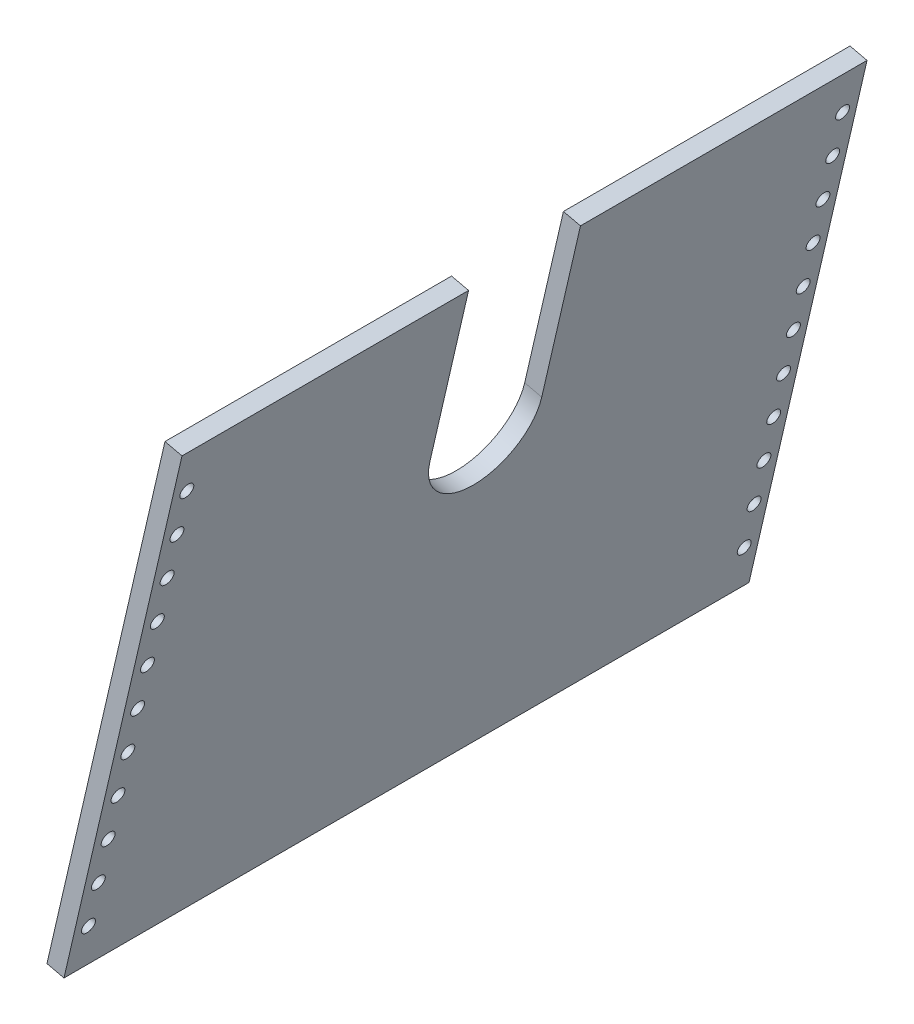
ISO-10303-21;
HEADER;
FILE_DESCRIPTION(('STEP AP214'),'2;1');
FILE_NAME('part.step','',(''),(''),'','','');
FILE_SCHEMA(('AUTOMOTIVE_DESIGN { 1 0 10303 214 1 1 1 1 }'));
ENDSEC;
DATA;
#1=APPLICATION_CONTEXT('core data for automotive mechanical design processes');
#2=APPLICATION_PROTOCOL_DEFINITION('international standard','automotive_design',2000,#1);
#3=PRODUCT_CONTEXT('',#1,'mechanical');
#4=PRODUCT('Part','Part','',(#3));
#5=PRODUCT_RELATED_PRODUCT_CATEGORY('part','',(#4));
#6=PRODUCT_DEFINITION_FORMATION('','',#4);
#7=PRODUCT_DEFINITION_CONTEXT('part definition',#1,'design');
#8=PRODUCT_DEFINITION('design','',#6,#7);
#9=PRODUCT_DEFINITION_SHAPE('','',#8);
#10=(LENGTH_UNIT() NAMED_UNIT(*) SI_UNIT(.MILLI.,.METRE.));
#11=(NAMED_UNIT(*) PLANE_ANGLE_UNIT() SI_UNIT($,.RADIAN.));
#12=(NAMED_UNIT(*) SI_UNIT($,.STERADIAN.) SOLID_ANGLE_UNIT());
#13=UNCERTAINTY_MEASURE_WITH_UNIT(LENGTH_MEASURE(1.E-05),#10,'distance_accuracy_value','');
#14=(GEOMETRIC_REPRESENTATION_CONTEXT(3) GLOBAL_UNCERTAINTY_ASSIGNED_CONTEXT((#13)) GLOBAL_UNIT_ASSIGNED_CONTEXT((#10,
#11,#12)) REPRESENTATION_CONTEXT('',''));
#15=CARTESIAN_POINT('',(0.,0.,0.));
#16=DIRECTION('',(0.,0.,1.));
#17=DIRECTION('',(1.,0.,0.));
#18=AXIS2_PLACEMENT_3D('',#15,#16,#17);
#19=CARTESIAN_POINT('',(164.308235452831,1831.59349845867,398.));
#20=DIRECTION('',(-0.224951054343888,-0.97437006478523,0.));
#21=DIRECTION('',(0.97437006478523,-0.224951054343888,0.));
#22=AXIS2_PLACEMENT_3D('',#19,#20,#21);
#23=PLANE('',#22);
#24=DIRECTION('',(0.,0.,-1.));
#25=VECTOR('',#24,1.);
#26=CARTESIAN_POINT('',(174.20783531105,1829.30799574654,398.));
#27=LINE('',#26,#25);
#28=CARTESIAN_POINT('',(174.20783531105,1829.30799574654,398.));
#29=VERTEX_POINT('',#28);
#30=CARTESIAN_POINT('',(174.20783531105,1829.30799574654,231.5));
#31=VERTEX_POINT('',#30);
#32=EDGE_CURVE('E169',#29,#31,#27,.T.);
#33=ORIENTED_EDGE('',*,*,#32,.T.);
#34=DIRECTION('',(0.974370064785234,-0.224951054343872,0.));
#35=VECTOR('',#34,1.);
#36=CARTESIAN_POINT('',(99.2127513138294,1846.62197513228,231.5));
#37=LINE('',#36,#35);
#38=CARTESIAN_POINT('',(164.308235452831,1831.59349845867,231.5));
#39=VERTEX_POINT('',#38);
#40=EDGE_CURVE('E117',#39,#31,#37,.T.);
#41=ORIENTED_EDGE('',*,*,#40,.F.);
#42=DIRECTION('',(0.,0.,-1.));
#43=VECTOR('',#42,1.);
#44=CARTESIAN_POINT('',(164.308235452831,1831.59349845867,398.));
#45=LINE('',#44,#43);
#46=CARTESIAN_POINT('',(164.308235452831,1831.59349845867,398.));
#47=VERTEX_POINT('',#46);
#48=EDGE_CURVE('E130',#47,#39,#45,.T.);
#49=ORIENTED_EDGE('',*,*,#48,.F.);
#50=DIRECTION('',(-0.97437006478523,0.224951054343888,0.));
#51=VECTOR('',#50,1.);
#52=CARTESIAN_POINT('',(164.308235452831,1831.59349845867,398.));
#53=LINE('',#52,#51);
#54=EDGE_CURVE('E156',#29,#47,#53,.T.);
#55=ORIENTED_EDGE('',*,*,#54,.F.);
#56=EDGE_LOOP('',(#33,#41,#49,#55));
#57=FACE_BOUND('',#56,.T.);
#58=ADVANCED_FACE('F37',(#57),#23,.F.);
#59=CARTESIAN_POINT('',(164.308235452831,1831.59349845867,166.5));
#60=VERTEX_POINT('',#59);
#61=CARTESIAN_POINT('',(164.308235452831,1831.59349845867,0.));
#62=VERTEX_POINT('',#61);
#63=EDGE_CURVE('E121',#60,#62,#45,.T.);
#64=ORIENTED_EDGE('',*,*,#63,.F.);
#65=DIRECTION('',(0.974370064785234,-0.224951054343872,0.));
#66=VECTOR('',#65,1.);
#67=CARTESIAN_POINT('',(99.2127513138294,1846.62197513228,166.5));
#68=LINE('',#67,#66);
#69=CARTESIAN_POINT('',(174.20783531105,1829.30799574654,166.5));
#70=VERTEX_POINT('',#69);
#71=EDGE_CURVE('E110',#60,#70,#68,.T.);
#72=ORIENTED_EDGE('',*,*,#71,.T.);
#73=CARTESIAN_POINT('',(174.20783531105,1829.30799574654,0.));
#74=VERTEX_POINT('',#73);
#75=EDGE_CURVE('E83',#70,#74,#27,.T.);
#76=ORIENTED_EDGE('',*,*,#75,.T.);
#77=DIRECTION('',(-0.97437006478523,0.224951054343888,0.));
#78=VECTOR('',#77,1.);
#79=CARTESIAN_POINT('',(164.308235452831,1831.59349845867,0.));
#80=LINE('',#79,#78);
#81=EDGE_CURVE('E129',#74,#62,#80,.T.);
#82=ORIENTED_EDGE('',*,*,#81,.T.);
#83=EDGE_LOOP('',(#64,#72,#76,#82));
#84=FACE_BOUND('',#83,.T.);
#85=ADVANCED_FACE('F39',(#84),#23,.F.);
#86=CARTESIAN_POINT('',(95.7431540888192,1534.60550271213,398.));
#87=DIRECTION('',(0.974370064785234,-0.224951054343871,0.));
#88=DIRECTION('',(0.224951054343871,0.974370064785234,0.));
#89=AXIS2_PLACEMENT_3D('',#86,#87,#88);
#90=PLANE('',#89);
#91=CARTESIAN_POINT('',(124.311937990491,1658.35050093986,389.5));
#92=DIRECTION('',(0.974370064785234,-0.224951054343871,0.));
#93=DIRECTION('',(0.224951054343871,0.974370064785234,0.));
#94=AXIS2_PLACEMENT_3D('',#91,#92,#93);
#95=CIRCLE('',#94,3.96875000000008);
#96=CARTESIAN_POINT('',(125.204712487418,1662.21753213447,389.5));
#97=VERTEX_POINT('',#96);
#98=EDGE_CURVE('E150',#97,#97,#95,.T.);
#99=ORIENTED_EDGE('',*,*,#98,.T.);
#100=EDGE_LOOP('',(#99));
#101=FACE_BOUND('',#100,.T.);
#102=CARTESIAN_POINT('',(118.598181210157,1633.60150129431,389.5));
#103=DIRECTION('',(0.974370064785234,-0.224951054343871,0.));
#104=DIRECTION('',(0.224951054343871,0.974370064785234,0.));
#105=AXIS2_PLACEMENT_3D('',#102,#103,#104);
#106=CIRCLE('',#105,3.96875000000008);
#107=CARTESIAN_POINT('',(119.490955707084,1637.46853248893,389.5));
#108=VERTEX_POINT('',#107);
#109=EDGE_CURVE('E555',#108,#108,#106,.T.);
#110=ORIENTED_EDGE('',*,*,#109,.T.);
#111=EDGE_LOOP('',(#110));
#112=FACE_BOUND('',#111,.T.);
#113=CARTESIAN_POINT('',(118.598181210157,1633.60150129431,8.49999999999979));
#114=DIRECTION('',(0.974370064785234,-0.224951054343871,0.));
#115=DIRECTION('',(0.224951054343871,0.974370064785234,0.));
#116=AXIS2_PLACEMENT_3D('',#113,#114,#115);
#117=CIRCLE('',#116,3.96875000000008);
#118=CARTESIAN_POINT('',(119.490955707084,1637.46853248893,8.49999999999979));
#119=VERTEX_POINT('',#118);
#120=EDGE_CURVE('E557',#119,#119,#117,.T.);
#121=ORIENTED_EDGE('',*,*,#120,.T.);
#122=EDGE_LOOP('',(#121));
#123=FACE_BOUND('',#122,.T.);
#124=CARTESIAN_POINT('',(124.311937990491,1658.35050093986,8.49999999999984));
#125=DIRECTION('',(0.974370064785234,-0.224951054343871,0.));
#126=DIRECTION('',(0.224951054343871,0.974370064785234,0.));
#127=AXIS2_PLACEMENT_3D('',#124,#125,#126);
#128=CIRCLE('',#127,3.96875000000008);
#129=CARTESIAN_POINT('',(125.204712487418,1662.21753213447,8.49999999999984));
#130=VERTEX_POINT('',#129);
#131=EDGE_CURVE('E560',#130,#130,#128,.T.);
#132=ORIENTED_EDGE('',*,*,#131,.T.);
#133=EDGE_LOOP('',(#132));
#134=FACE_BOUND('',#133,.T.);
#135=CARTESIAN_POINT('',(158.594478672497,1806.84449881313,8.49999999999951));
#136=DIRECTION('',(0.974370064785234,-0.224951054343871,0.));
#137=DIRECTION('',(0.224951054343871,0.974370064785234,0.));
#138=AXIS2_PLACEMENT_3D('',#135,#136,#137);
#139=CIRCLE('',#138,3.96875000000001);
#140=CARTESIAN_POINT('',(159.487253169424,1810.71153000774,8.49999999999951));
#141=VERTEX_POINT('',#140);
#142=EDGE_CURVE('E565',#141,#141,#139,.T.);
#143=ORIENTED_EDGE('',*,*,#142,.T.);
#144=EDGE_LOOP('',(#143));
#145=FACE_BOUND('',#144,.T.);
#146=CARTESIAN_POINT('',(101.456910869154,1559.35450235768,8.49999999999951));
#147=DIRECTION('',(0.974370064785234,-0.224951054343871,0.));
#148=DIRECTION('',(0.224951054343871,0.974370064785234,0.));
#149=AXIS2_PLACEMENT_3D('',#146,#147,#148);
#150=CIRCLE('',#149,3.96875000000001);
#151=CARTESIAN_POINT('',(102.349685366081,1563.22153355229,8.49999999999951));
#152=VERTEX_POINT('',#151);
#153=EDGE_CURVE('E568',#152,#152,#150,.T.);
#154=ORIENTED_EDGE('',*,*,#153,.T.);
#155=EDGE_LOOP('',(#154));
#156=FACE_BOUND('',#155,.T.);
#157=CARTESIAN_POINT('',(112.884424429822,1608.85250164877,8.49999999999967));
#158=DIRECTION('',(0.974370064785234,-0.224951054343871,0.));
#159=DIRECTION('',(0.224951054343871,0.974370064785234,0.));
#160=AXIS2_PLACEMENT_3D('',#157,#158,#159);
#161=CIRCLE('',#160,3.96875000000001);
#162=CARTESIAN_POINT('',(113.77719892675,1612.71953284338,8.49999999999967));
#163=VERTEX_POINT('',#162);
#164=EDGE_CURVE('E571',#163,#163,#161,.T.);
#165=ORIENTED_EDGE('',*,*,#164,.T.);
#166=EDGE_LOOP('',(#165));
#167=FACE_BOUND('',#166,.T.);
#168=CARTESIAN_POINT('',(107.170667649488,1584.10350200322,8.49999999999962));
#169=DIRECTION('',(0.974370064785234,-0.224951054343871,0.));
#170=DIRECTION('',(0.224951054343871,0.974370064785234,0.));
#171=AXIS2_PLACEMENT_3D('',#168,#169,#170);
#172=CIRCLE('',#171,3.96875000000001);
#173=CARTESIAN_POINT('',(108.063442146415,1587.97053319784,8.49999999999962));
#174=VERTEX_POINT('',#173);
#175=EDGE_CURVE('E574',#174,#174,#172,.T.);
#176=ORIENTED_EDGE('',*,*,#175,.T.);
#177=EDGE_LOOP('',(#176));
#178=FACE_BOUND('',#177,.T.);
#179=CARTESIAN_POINT('',(141.453208331494,1732.59749987649,389.5));
#180=DIRECTION('',(0.974370064785234,-0.224951054343871,0.));
#181=DIRECTION('',(0.224951054343871,0.974370064785234,0.));
#182=AXIS2_PLACEMENT_3D('',#179,#180,#181);
#183=CIRCLE('',#182,3.96875000000008);
#184=CARTESIAN_POINT('',(142.345982828421,1736.46453107111,389.5));
#185=VERTEX_POINT('',#184);
#186=EDGE_CURVE('E577',#185,#185,#183,.T.);
#187=ORIENTED_EDGE('',*,*,#186,.T.);
#188=EDGE_LOOP('',(#187));
#189=FACE_BOUND('',#188,.T.);
#190=CARTESIAN_POINT('',(147.166965111828,1757.34649952203,389.5));
#191=DIRECTION('',(0.974370064785234,-0.224951054343871,0.));
#192=DIRECTION('',(0.224951054343871,0.974370064785234,0.));
#193=AXIS2_PLACEMENT_3D('',#190,#191,#192);
#194=CIRCLE('',#193,3.96875000000008);
#195=CARTESIAN_POINT('',(148.059739608755,1761.21353071665,389.5));
#196=VERTEX_POINT('',#195);
#197=EDGE_CURVE('E580',#196,#196,#194,.T.);
#198=ORIENTED_EDGE('',*,*,#197,.T.);
#199=EDGE_LOOP('',(#198));
#200=FACE_BOUND('',#199,.T.);
#201=CARTESIAN_POINT('',(135.73945155116,1707.84850023095,389.5));
#202=DIRECTION('',(0.974370064785234,-0.224951054343871,0.));
#203=DIRECTION('',(0.224951054343871,0.974370064785234,0.));
#204=AXIS2_PLACEMENT_3D('',#201,#202,#203);
#205=CIRCLE('',#204,3.96875000000001);
#206=CARTESIAN_POINT('',(136.632226048087,1711.71553142556,389.5));
#207=VERTEX_POINT('',#206);
#208=EDGE_CURVE('E583',#207,#207,#205,.T.);
#209=ORIENTED_EDGE('',*,*,#208,.T.);
#210=EDGE_LOOP('',(#209));
#211=FACE_BOUND('',#210,.T.);
#212=CARTESIAN_POINT('',(101.456910869154,1559.35450235768,389.500000000001));
#213=DIRECTION('',(0.974370064785234,-0.224951054343871,0.));
#214=DIRECTION('',(0.224951054343871,0.974370064785234,0.));
#215=AXIS2_PLACEMENT_3D('',#212,#213,#214);
#216=CIRCLE('',#215,3.96875000000001);
#217=CARTESIAN_POINT('',(102.349685366081,1563.22153355229,389.500000000001));
#218=VERTEX_POINT('',#217);
#219=EDGE_CURVE('E586',#218,#218,#216,.T.);
#220=ORIENTED_EDGE('',*,*,#219,.T.);
#221=EDGE_LOOP('',(#220));
#222=FACE_BOUND('',#221,.T.);
#223=CARTESIAN_POINT('',(158.594478672497,1806.84449881313,389.500000000001));
#224=DIRECTION('',(0.974370064785234,-0.224951054343871,0.));
#225=DIRECTION('',(0.224951054343871,0.974370064785234,0.));
#226=AXIS2_PLACEMENT_3D('',#223,#224,#225);
#227=CIRCLE('',#226,3.96875000000001);
#228=CARTESIAN_POINT('',(159.487253169424,1810.71153000774,389.500000000001));
#229=VERTEX_POINT('',#228);
#230=EDGE_CURVE('E589',#229,#229,#227,.T.);
#231=ORIENTED_EDGE('',*,*,#230,.T.);
#232=EDGE_LOOP('',(#231));
#233=FACE_BOUND('',#232,.T.);
#234=CARTESIAN_POINT('',(152.880721892162,1782.09549916758,389.5));
#235=DIRECTION('',(0.974370064785234,-0.224951054343871,0.));
#236=DIRECTION('',(0.224951054343871,0.974370064785234,0.));
#237=AXIS2_PLACEMENT_3D('',#234,#235,#236);
#238=CIRCLE('',#237,3.96875000000008);
#239=CARTESIAN_POINT('',(153.77349638909,1785.9625303622,389.5));
#240=VERTEX_POINT('',#239);
#241=EDGE_CURVE('E592',#240,#240,#238,.T.);
#242=ORIENTED_EDGE('',*,*,#241,.T.);
#243=EDGE_LOOP('',(#242));
#244=FACE_BOUND('',#243,.T.);
#245=CARTESIAN_POINT('',(112.884424429822,1608.85250164877,389.5));
#246=DIRECTION('',(0.974370064785234,-0.224951054343871,0.));
#247=DIRECTION('',(0.224951054343871,0.974370064785234,0.));
#248=AXIS2_PLACEMENT_3D('',#245,#246,#247);
#249=CIRCLE('',#248,3.96875000000001);
#250=CARTESIAN_POINT('',(113.77719892675,1612.71953284338,389.5));
#251=VERTEX_POINT('',#250);
#252=EDGE_CURVE('E595',#251,#251,#249,.T.);
#253=ORIENTED_EDGE('',*,*,#252,.T.);
#254=EDGE_LOOP('',(#253));
#255=FACE_BOUND('',#254,.T.);
#256=CARTESIAN_POINT('',(107.170667649488,1584.10350200322,389.5));
#257=DIRECTION('',(0.974370064785234,-0.224951054343871,0.));
#258=DIRECTION('',(0.224951054343871,0.974370064785234,0.));
#259=AXIS2_PLACEMENT_3D('',#256,#257,#258);
#260=CIRCLE('',#259,3.96875000000001);
#261=CARTESIAN_POINT('',(108.063442146415,1587.97053319784,389.5));
#262=VERTEX_POINT('',#261);
#263=EDGE_CURVE('E598',#262,#262,#260,.T.);
#264=ORIENTED_EDGE('',*,*,#263,.T.);
#265=EDGE_LOOP('',(#264));
#266=FACE_BOUND('',#265,.T.);
#267=CARTESIAN_POINT('',(130.025694770825,1683.0995005854,8.50000000000001));
#268=DIRECTION('',(0.974370064785234,-0.224951054343871,0.));
#269=DIRECTION('',(0.224951054343871,0.974370064785234,0.));
#270=AXIS2_PLACEMENT_3D('',#267,#268,#269);
#271=CIRCLE('',#270,3.96874999999996);
#272=CARTESIAN_POINT('',(130.918469267752,1686.96653178002,8.50000000000001));
#273=VERTEX_POINT('',#272);
#274=EDGE_CURVE('E601',#273,#273,#271,.T.);
#275=ORIENTED_EDGE('',*,*,#274,.T.);
#276=EDGE_LOOP('',(#275));
#277=FACE_BOUND('',#276,.T.);
#278=CARTESIAN_POINT('',(147.166965111828,1757.34649952203,8.49999999999967));
#279=DIRECTION('',(0.974370064785234,-0.224951054343871,0.));
#280=DIRECTION('',(0.224951054343871,0.974370064785234,0.));
#281=AXIS2_PLACEMENT_3D('',#278,#279,#280);
#282=CIRCLE('',#281,3.96875000000008);
#283=CARTESIAN_POINT('',(148.059739608755,1761.21353071665,8.49999999999967));
#284=VERTEX_POINT('',#283);
#285=EDGE_CURVE('E604',#284,#284,#282,.T.);
#286=ORIENTED_EDGE('',*,*,#285,.T.);
#287=EDGE_LOOP('',(#286));
#288=FACE_BOUND('',#287,.T.);
#289=CARTESIAN_POINT('',(152.880721892162,1782.09549916758,8.49999999999962));
#290=DIRECTION('',(0.974370064785234,-0.224951054343871,0.));
#291=DIRECTION('',(0.224951054343871,0.974370064785234,0.));
#292=AXIS2_PLACEMENT_3D('',#289,#290,#291);
#293=CIRCLE('',#292,3.96875000000008);
#294=CARTESIAN_POINT('',(153.77349638909,1785.9625303622,8.49999999999962));
#295=VERTEX_POINT('',#294);
#296=EDGE_CURVE('E607',#295,#295,#293,.T.);
#297=ORIENTED_EDGE('',*,*,#296,.T.);
#298=EDGE_LOOP('',(#297));
#299=FACE_BOUND('',#298,.T.);
#300=CARTESIAN_POINT('',(135.73945155116,1707.84850023095,8.49999999999984));
#301=DIRECTION('',(0.974370064785234,-0.224951054343871,0.));
#302=DIRECTION('',(0.224951054343871,0.974370064785234,0.));
#303=AXIS2_PLACEMENT_3D('',#300,#301,#302);
#304=CIRCLE('',#303,3.96875000000001);
#305=CARTESIAN_POINT('',(136.632226048087,1711.71553142556,8.49999999999984));
#306=VERTEX_POINT('',#305);
#307=EDGE_CURVE('E610',#306,#306,#304,.T.);
#308=ORIENTED_EDGE('',*,*,#307,.T.);
#309=EDGE_LOOP('',(#308));
#310=FACE_BOUND('',#309,.T.);
#311=CARTESIAN_POINT('',(141.453208331494,1732.59749987649,8.49999999999979));
#312=DIRECTION('',(0.974370064785234,-0.224951054343871,0.));
#313=DIRECTION('',(0.224951054343871,0.974370064785234,0.));
#314=AXIS2_PLACEMENT_3D('',#311,#312,#313);
#315=CIRCLE('',#314,3.96875000000008);
#316=CARTESIAN_POINT('',(142.345982828421,1736.46453107111,8.49999999999979));
#317=VERTEX_POINT('',#316);
#318=EDGE_CURVE('E613',#317,#317,#315,.T.);
#319=ORIENTED_EDGE('',*,*,#318,.T.);
#320=EDGE_LOOP('',(#319));
#321=FACE_BOUND('',#320,.T.);
#322=CARTESIAN_POINT('',(130.025694770825,1683.0995005854,389.5));
#323=DIRECTION('',(0.974370064785234,-0.224951054343871,0.));
#324=DIRECTION('',(0.224951054343871,0.974370064785234,0.));
#325=AXIS2_PLACEMENT_3D('',#322,#323,#324);
#326=CIRCLE('',#325,3.96875000000001);
#327=CARTESIAN_POINT('',(130.918469267752,1686.96653178002,389.5));
#328=VERTEX_POINT('',#327);
#329=EDGE_CURVE('E616',#328,#328,#326,.T.);
#330=ORIENTED_EDGE('',*,*,#329,.T.);
#331=EDGE_LOOP('',(#330));
#332=FACE_BOUND('',#331,.T.);
#333=ORIENTED_EDGE('',*,*,#48,.T.);
#334=DIRECTION('',(-0.224951054343871,-0.974370064785234,0.));
#335=VECTOR('',#334,1.);
#336=CARTESIAN_POINT('',(95.7431540888192,1534.60550271213,231.5));
#337=LINE('',#336,#335);
#338=CARTESIAN_POINT('',(141.813130018444,1734.15649198015,231.5));
#339=VERTEX_POINT('',#338);
#340=EDGE_CURVE('E125',#39,#339,#337,.T.);
#341=ORIENTED_EDGE('',*,*,#340,.T.);
#342=CARTESIAN_POINT('',(141.813130018444,1734.15649198015,199.));
#343=DIRECTION('',(0.974370064785234,-0.224951054343871,0.));
#344=DIRECTION('',(0.224951054343871,0.974370064785234,0.));
#345=AXIS2_PLACEMENT_3D('',#342,#343,#344);
#346=CIRCLE('',#345,32.5);
#347=CARTESIAN_POINT('',(141.813130018444,1734.15649198015,166.5));
#348=VERTEX_POINT('',#347);
#349=EDGE_CURVE('E124',#339,#348,#346,.T.);
#350=ORIENTED_EDGE('',*,*,#349,.T.);
#351=DIRECTION('',(0.224951054343871,0.974370064785234,0.));
#352=VECTOR('',#351,1.);
#353=CARTESIAN_POINT('',(95.7431540888192,1534.60550271213,166.5));
#354=LINE('',#353,#352);
#355=EDGE_CURVE('E113',#348,#60,#354,.T.);
#356=ORIENTED_EDGE('',*,*,#355,.T.);
#357=ORIENTED_EDGE('',*,*,#63,.T.);
#358=DIRECTION('',(-0.224951054343871,-0.974370064785234,0.));
#359=VECTOR('',#358,1.);
#360=CARTESIAN_POINT('',(95.7431540888192,1534.60550271213,0.));
#361=LINE('',#360,#359);
#362=CARTESIAN_POINT('',(95.7431540888192,1534.60550271213,0.));
#363=VERTEX_POINT('',#362);
#364=EDGE_CURVE('E164',#62,#363,#361,.T.);
#365=ORIENTED_EDGE('',*,*,#364,.T.);
#366=DIRECTION('',(0.,0.,-1.));
#367=VECTOR('',#366,1.);
#368=CARTESIAN_POINT('',(95.7431540888192,1534.60550271213,398.));
#369=LINE('',#368,#367);
#370=CARTESIAN_POINT('',(95.7431540888192,1534.60550271213,398.));
#371=VERTEX_POINT('',#370);
#372=EDGE_CURVE('E131',#371,#363,#369,.T.);
#373=ORIENTED_EDGE('',*,*,#372,.F.);
#374=DIRECTION('',(-0.224951054343871,-0.974370064785234,0.));
#375=VECTOR('',#374,1.);
#376=CARTESIAN_POINT('',(95.7431540888192,1534.60550271213,398.));
#377=LINE('',#376,#375);
#378=EDGE_CURVE('E91',#47,#371,#377,.T.);
#379=ORIENTED_EDGE('',*,*,#378,.F.);
#380=EDGE_LOOP('',(#333,#341,#350,#356,#357,#365,#373,#379));
#381=FACE_BOUND('',#380,.T.);
#382=ADVANCED_FACE('F120',(#101,#112,#123,#134,#145,#156,#167,#178,#189,#200,#211,#222,#233,
#244,#255,#266,#277,#288,#299,#310,#321,#332,#381),#90,.F.);
#383=CARTESIAN_POINT('',(105.642753947037,1532.32,398.));
#384=DIRECTION('',(0.224951054343871,0.974370064785234,0.));
#385=DIRECTION('',(-0.974370064785234,0.224951054343871,0.));
#386=AXIS2_PLACEMENT_3D('',#383,#384,#385);
#387=PLANE('',#386);
#388=DIRECTION('',(0.974370064785234,-0.224951054343871,0.));
#389=VECTOR('',#388,1.);
#390=CARTESIAN_POINT('',(105.642753947037,1532.32,0.));
#391=LINE('',#390,#389);
#392=CARTESIAN_POINT('',(105.642753947037,1532.32,0.));
#393=VERTEX_POINT('',#392);
#394=EDGE_CURVE('E166',#363,#393,#391,.T.);
#395=ORIENTED_EDGE('',*,*,#394,.T.);
#396=DIRECTION('',(0.,0.,-1.));
#397=VECTOR('',#396,1.);
#398=CARTESIAN_POINT('',(105.642753947037,1532.32,398.));
#399=LINE('',#398,#397);
#400=CARTESIAN_POINT('',(105.642753947037,1532.32,398.));
#401=VERTEX_POINT('',#400);
#402=EDGE_CURVE('E134',#401,#393,#399,.T.);
#403=ORIENTED_EDGE('',*,*,#402,.F.);
#404=DIRECTION('',(0.974370064785234,-0.224951054343871,0.));
#405=VECTOR('',#404,1.);
#406=CARTESIAN_POINT('',(105.642753947037,1532.32,398.));
#407=LINE('',#406,#405);
#408=EDGE_CURVE('E160',#371,#401,#407,.T.);
#409=ORIENTED_EDGE('',*,*,#408,.F.);
#410=ORIENTED_EDGE('',*,*,#372,.T.);
#411=EDGE_LOOP('',(#395,#403,#409,#410));
#412=FACE_BOUND('',#411,.T.);
#413=ADVANCED_FACE('F178',(#412),#387,.F.);
#414=CARTESIAN_POINT('',(174.20783531105,1829.30799574654,398.));
#415=DIRECTION('',(-0.974370064785234,0.224951054343872,0.));
#416=DIRECTION('',(-0.224951054343872,-0.974370064785234,0.));
#417=AXIS2_PLACEMENT_3D('',#414,#415,#416);
#418=PLANE('',#417);
#419=CARTESIAN_POINT('',(134.211537848709,1656.06499822772,389.5));
#420=DIRECTION('',(0.974370064785234,-0.224951054343872,0.));
#421=DIRECTION('',(-0.224951054343872,-0.974370064785234,0.));
#422=AXIS2_PLACEMENT_3D('',#419,#420,#421);
#423=CIRCLE('',#422,3.96875000000008);
#424=CARTESIAN_POINT('',(133.318763351782,1652.19796703311,389.5));
#425=VERTEX_POINT('',#424);
#426=EDGE_CURVE('E553',#425,#425,#423,.T.);
#427=ORIENTED_EDGE('',*,*,#426,.F.);
#428=EDGE_LOOP('',(#427));
#429=FACE_BOUND('',#428,.T.);
#430=CARTESIAN_POINT('',(128.497781068375,1631.31599858218,389.5));
#431=DIRECTION('',(0.974370064785234,-0.224951054343872,0.));
#432=DIRECTION('',(-0.224951054343872,-0.974370064785234,0.));
#433=AXIS2_PLACEMENT_3D('',#430,#431,#432);
#434=CIRCLE('',#433,3.96875000000008);
#435=CARTESIAN_POINT('',(127.605006571448,1627.44896738756,389.5));
#436=VERTEX_POINT('',#435);
#437=EDGE_CURVE('E642',#436,#436,#434,.T.);
#438=ORIENTED_EDGE('',*,*,#437,.F.);
#439=EDGE_LOOP('',(#438));
#440=FACE_BOUND('',#439,.T.);
#441=CARTESIAN_POINT('',(128.497781068375,1631.31599858218,8.49999999999979));
#442=DIRECTION('',(0.974370064785234,-0.224951054343872,0.));
#443=DIRECTION('',(0.224951054343872,0.974370064785234,0.));
#444=AXIS2_PLACEMENT_3D('',#441,#442,#443);
#445=CIRCLE('',#444,3.96875000000008);
#446=CARTESIAN_POINT('',(129.390555565302,1635.18302977679,8.49999999999979));
#447=VERTEX_POINT('',#446);
#448=EDGE_CURVE('E650',#447,#447,#445,.T.);
#449=ORIENTED_EDGE('',*,*,#448,.F.);
#450=EDGE_LOOP('',(#449));
#451=FACE_BOUND('',#450,.T.);
#452=CARTESIAN_POINT('',(134.211537848709,1656.06499822772,8.49999999999984));
#453=DIRECTION('',(0.974370064785234,-0.224951054343872,0.));
#454=DIRECTION('',(0.224951054343872,0.974370064785234,0.));
#455=AXIS2_PLACEMENT_3D('',#452,#453,#454);
#456=CIRCLE('',#455,3.96875000000008);
#457=CARTESIAN_POINT('',(135.104312345637,1659.93202942234,8.49999999999984));
#458=VERTEX_POINT('',#457);
#459=EDGE_CURVE('E647',#458,#458,#456,.T.);
#460=ORIENTED_EDGE('',*,*,#459,.F.);
#461=EDGE_LOOP('',(#460));
#462=FACE_BOUND('',#461,.T.);
#463=CARTESIAN_POINT('',(168.494078530715,1804.55899610099,8.49999999999951));
#464=DIRECTION('',(0.974370064785234,-0.224951054343872,0.));
#465=DIRECTION('',(-0.224951054343872,-0.974370064785234,0.));
#466=AXIS2_PLACEMENT_3D('',#463,#464,#465);
#467=CIRCLE('',#466,3.96875000000001);
#468=CARTESIAN_POINT('',(167.601304033788,1800.69196490637,8.49999999999951));
#469=VERTEX_POINT('',#468);
#470=EDGE_CURVE('E663',#469,#469,#467,.T.);
#471=ORIENTED_EDGE('',*,*,#470,.F.);
#472=EDGE_LOOP('',(#471));
#473=FACE_BOUND('',#472,.T.);
#474=CARTESIAN_POINT('',(111.356510727372,1557.06899964554,8.49999999999951));
#475=DIRECTION('',(0.974370064785234,-0.224951054343872,0.));
#476=DIRECTION('',(0.224951054343872,0.974370064785234,0.));
#477=AXIS2_PLACEMENT_3D('',#474,#475,#476);
#478=CIRCLE('',#477,3.96875000000001);
#479=CARTESIAN_POINT('',(112.249285224299,1560.93603084016,8.49999999999951));
#480=VERTEX_POINT('',#479);
#481=EDGE_CURVE('E662',#480,#480,#478,.T.);
#482=ORIENTED_EDGE('',*,*,#481,.F.);
#483=EDGE_LOOP('',(#482));
#484=FACE_BOUND('',#483,.T.);
#485=CARTESIAN_POINT('',(122.784024288041,1606.56699893663,8.49999999999967));
#486=DIRECTION('',(0.974370064785234,-0.224951054343872,0.));
#487=DIRECTION('',(0.224951054343872,0.974370064785234,0.));
#488=AXIS2_PLACEMENT_3D('',#485,#486,#487);
#489=CIRCLE('',#488,3.96875000000001);
#490=CARTESIAN_POINT('',(123.676798784968,1610.43403013125,8.49999999999967));
#491=VERTEX_POINT('',#490);
#492=EDGE_CURVE('E653',#491,#491,#489,.T.);
#493=ORIENTED_EDGE('',*,*,#492,.F.);
#494=EDGE_LOOP('',(#493));
#495=FACE_BOUND('',#494,.T.);
#496=CARTESIAN_POINT('',(117.070267507706,1581.81799929109,8.49999999999962));
#497=DIRECTION('',(0.974370064785234,-0.224951054343872,0.));
#498=DIRECTION('',(0.224951054343872,0.974370064785234,0.));
#499=AXIS2_PLACEMENT_3D('',#496,#497,#498);
#500=CIRCLE('',#499,3.96875000000001);
#501=CARTESIAN_POINT('',(117.963042004634,1585.6850304857,8.49999999999962));
#502=VERTEX_POINT('',#501);
#503=EDGE_CURVE('E659',#502,#502,#500,.T.);
#504=ORIENTED_EDGE('',*,*,#503,.F.);
#505=EDGE_LOOP('',(#504));
#506=FACE_BOUND('',#505,.T.);
#507=CARTESIAN_POINT('',(151.352808189712,1730.31199716436,389.5));
#508=DIRECTION('',(0.974370064785234,-0.224951054343872,0.));
#509=DIRECTION('',(0.224951054343872,0.974370064785234,0.));
#510=AXIS2_PLACEMENT_3D('',#507,#508,#509);
#511=CIRCLE('',#510,3.96875000000008);
#512=CARTESIAN_POINT('',(152.245582686639,1734.17902835897,389.5));
#513=VERTEX_POINT('',#512);
#514=EDGE_CURVE('E626',#513,#513,#511,.T.);
#515=ORIENTED_EDGE('',*,*,#514,.F.);
#516=EDGE_LOOP('',(#515));
#517=FACE_BOUND('',#516,.T.);
#518=CARTESIAN_POINT('',(157.066564970047,1755.0609968099,389.5));
#519=DIRECTION('',(0.974370064785234,-0.224951054343872,0.));
#520=DIRECTION('',(0.224951054343872,0.974370064785234,0.));
#521=AXIS2_PLACEMENT_3D('',#518,#519,#520);
#522=CIRCLE('',#521,3.96875000000008);
#523=CARTESIAN_POINT('',(157.959339466974,1758.92802800452,389.5));
#524=VERTEX_POINT('',#523);
#525=EDGE_CURVE('E631',#524,#524,#522,.T.);
#526=ORIENTED_EDGE('',*,*,#525,.F.);
#527=EDGE_LOOP('',(#526));
#528=FACE_BOUND('',#527,.T.);
#529=CARTESIAN_POINT('',(145.639051409378,1705.56299751881,389.5));
#530=DIRECTION('',(0.974370064785234,-0.224951054343872,0.));
#531=DIRECTION('',(0.224951054343872,0.974370064785234,0.));
#532=AXIS2_PLACEMENT_3D('',#529,#530,#531);
#533=CIRCLE('',#532,3.96875000000001);
#534=CARTESIAN_POINT('',(146.531825906305,1709.43002871343,389.5));
#535=VERTEX_POINT('',#534);
#536=EDGE_CURVE('E623',#535,#535,#533,.T.);
#537=ORIENTED_EDGE('',*,*,#536,.F.);
#538=EDGE_LOOP('',(#537));
#539=FACE_BOUND('',#538,.T.);
#540=CARTESIAN_POINT('',(111.356510727372,1557.06899964554,389.500000000001));
#541=DIRECTION('',(0.974370064785234,-0.224951054343872,0.));
#542=DIRECTION('',(-0.224951054343872,-0.974370064785234,0.));
#543=AXIS2_PLACEMENT_3D('',#540,#541,#542);
#544=CIRCLE('',#543,3.96875000000001);
#545=CARTESIAN_POINT('',(110.463736230445,1553.20196845093,389.500000000001));
#546=VERTEX_POINT('',#545);
#547=EDGE_CURVE('E622',#546,#546,#544,.T.);
#548=ORIENTED_EDGE('',*,*,#547,.F.);
#549=EDGE_LOOP('',(#548));
#550=FACE_BOUND('',#549,.T.);
#551=CARTESIAN_POINT('',(168.494078530715,1804.55899610099,389.500000000001));
#552=DIRECTION('',(0.974370064785234,-0.224951054343872,0.));
#553=DIRECTION('',(0.224951054343872,0.974370064785234,0.));
#554=AXIS2_PLACEMENT_3D('',#551,#552,#553);
#555=CIRCLE('',#554,3.96875000000001);
#556=CARTESIAN_POINT('',(169.386853027643,1808.42602729561,389.500000000001));
#557=VERTEX_POINT('',#556);
#558=EDGE_CURVE('E638',#557,#557,#555,.T.);
#559=ORIENTED_EDGE('',*,*,#558,.F.);
#560=EDGE_LOOP('',(#559));
#561=FACE_BOUND('',#560,.T.);
#562=CARTESIAN_POINT('',(162.780321750381,1779.80999645545,389.5));
#563=DIRECTION('',(0.974370064785234,-0.224951054343872,0.));
#564=DIRECTION('',(0.224951054343872,0.974370064785234,0.));
#565=AXIS2_PLACEMENT_3D('',#562,#563,#564);
#566=CIRCLE('',#565,3.96875000000008);
#567=CARTESIAN_POINT('',(163.673096247308,1783.67702765006,389.5));
#568=VERTEX_POINT('',#567);
#569=EDGE_CURVE('E634',#568,#568,#566,.T.);
#570=ORIENTED_EDGE('',*,*,#569,.F.);
#571=EDGE_LOOP('',(#570));
#572=FACE_BOUND('',#571,.T.);
#573=CARTESIAN_POINT('',(122.784024288041,1606.56699893663,389.5));
#574=DIRECTION('',(0.974370064785234,-0.224951054343872,0.));
#575=DIRECTION('',(-0.224951054343872,-0.974370064785234,0.));
#576=AXIS2_PLACEMENT_3D('',#573,#574,#575);
#577=CIRCLE('',#576,3.96875000000001);
#578=CARTESIAN_POINT('',(121.891249791113,1602.69996774202,389.5));
#579=VERTEX_POINT('',#578);
#580=EDGE_CURVE('E639',#579,#579,#577,.T.);
#581=ORIENTED_EDGE('',*,*,#580,.F.);
#582=EDGE_LOOP('',(#581));
#583=FACE_BOUND('',#582,.T.);
#584=CARTESIAN_POINT('',(117.070267507706,1581.81799929109,389.5));
#585=DIRECTION('',(0.974370064785234,-0.224951054343872,0.));
#586=DIRECTION('',(-0.224951054343872,-0.974370064785234,0.));
#587=AXIS2_PLACEMENT_3D('',#584,#585,#586);
#588=CIRCLE('',#587,3.96875000000001);
#589=CARTESIAN_POINT('',(116.177493010779,1577.95096809647,389.5));
#590=VERTEX_POINT('',#589);
#591=EDGE_CURVE('E635',#590,#590,#588,.T.);
#592=ORIENTED_EDGE('',*,*,#591,.F.);
#593=EDGE_LOOP('',(#592));
#594=FACE_BOUND('',#593,.T.);
#595=CARTESIAN_POINT('',(139.925294629044,1680.81399787327,8.50000000000001));
#596=DIRECTION('',(0.974370064785234,-0.224951054343872,0.));
#597=DIRECTION('',(-0.224951054343872,-0.974370064785234,0.));
#598=AXIS2_PLACEMENT_3D('',#595,#596,#597);
#599=CIRCLE('',#598,3.96874999999996);
#600=CARTESIAN_POINT('',(139.032520132116,1676.94696667865,8.50000000000001));
#601=VERTEX_POINT('',#600);
#602=EDGE_CURVE('E680',#601,#601,#599,.T.);
#603=ORIENTED_EDGE('',*,*,#602,.F.);
#604=EDGE_LOOP('',(#603));
#605=FACE_BOUND('',#604,.T.);
#606=CARTESIAN_POINT('',(157.066564970047,1755.0609968099,8.49999999999967));
#607=DIRECTION('',(0.974370064785234,-0.224951054343872,0.));
#608=DIRECTION('',(-0.224951054343872,-0.974370064785234,0.));
#609=AXIS2_PLACEMENT_3D('',#606,#607,#608);
#610=CIRCLE('',#609,3.96875000000008);
#611=CARTESIAN_POINT('',(156.173790473119,1751.19396561528,8.49999999999967));
#612=VERTEX_POINT('',#611);
#613=EDGE_CURVE('E671',#612,#612,#610,.T.);
#614=ORIENTED_EDGE('',*,*,#613,.F.);
#615=EDGE_LOOP('',(#614));
#616=FACE_BOUND('',#615,.T.);
#617=CARTESIAN_POINT('',(162.780321750381,1779.80999645545,8.49999999999962));
#618=DIRECTION('',(0.974370064785234,-0.224951054343872,0.));
#619=DIRECTION('',(-0.224951054343872,-0.974370064785234,0.));
#620=AXIS2_PLACEMENT_3D('',#617,#618,#619);
#621=CIRCLE('',#620,3.96875000000008);
#622=CARTESIAN_POINT('',(161.887547253454,1775.94296526083,8.49999999999962));
#623=VERTEX_POINT('',#622);
#624=EDGE_CURVE('E666',#623,#623,#621,.T.);
#625=ORIENTED_EDGE('',*,*,#624,.F.);
#626=EDGE_LOOP('',(#625));
#627=FACE_BOUND('',#626,.T.);
#628=CARTESIAN_POINT('',(145.639051409378,1705.56299751881,8.49999999999984));
#629=DIRECTION('',(0.974370064785234,-0.224951054343872,0.));
#630=DIRECTION('',(-0.224951054343872,-0.974370064785234,0.));
#631=AXIS2_PLACEMENT_3D('',#628,#629,#630);
#632=CIRCLE('',#631,3.96875000000001);
#633=CARTESIAN_POINT('',(144.746276912451,1701.69596632419,8.49999999999984));
#634=VERTEX_POINT('',#633);
#635=EDGE_CURVE('E677',#634,#634,#632,.T.);
#636=ORIENTED_EDGE('',*,*,#635,.F.);
#637=EDGE_LOOP('',(#636));
#638=FACE_BOUND('',#637,.T.);
#639=CARTESIAN_POINT('',(151.352808189712,1730.31199716436,8.49999999999979));
#640=DIRECTION('',(0.974370064785234,-0.224951054343872,0.));
#641=DIRECTION('',(-0.224951054343872,-0.974370064785234,0.));
#642=AXIS2_PLACEMENT_3D('',#639,#640,#641);
#643=CIRCLE('',#642,3.96875000000008);
#644=CARTESIAN_POINT('',(150.460033692785,1726.44496596974,8.49999999999979));
#645=VERTEX_POINT('',#644);
#646=EDGE_CURVE('E674',#645,#645,#643,.T.);
#647=ORIENTED_EDGE('',*,*,#646,.F.);
#648=EDGE_LOOP('',(#647));
#649=FACE_BOUND('',#648,.T.);
#650=CARTESIAN_POINT('',(139.925294629044,1680.81399787327,389.5));
#651=DIRECTION('',(0.974370064785234,-0.224951054343872,0.));
#652=DIRECTION('',(0.224951054343872,0.974370064785234,0.));
#653=AXIS2_PLACEMENT_3D('',#650,#651,#652);
#654=CIRCLE('',#653,3.96875000000001);
#655=CARTESIAN_POINT('',(140.818069125971,1684.68102906788,389.5));
#656=VERTEX_POINT('',#655);
#657=EDGE_CURVE('E619',#656,#656,#654,.T.);
#658=ORIENTED_EDGE('',*,*,#657,.F.);
#659=EDGE_LOOP('',(#658));
#660=FACE_BOUND('',#659,.T.);
#661=CARTESIAN_POINT('',(151.712729876662,1731.87098926801,199.));
#662=DIRECTION('',(-0.974370064785234,0.224951054343872,0.));
#663=DIRECTION('',(-0.224951054343872,-0.974370064785234,0.));
#664=AXIS2_PLACEMENT_3D('',#661,#662,#663);
#665=CIRCLE('',#664,32.5);
#666=CARTESIAN_POINT('',(151.712729876662,1731.87098926801,166.5));
#667=VERTEX_POINT('',#666);
#668=CARTESIAN_POINT('',(151.712729876662,1731.87098926801,231.5));
#669=VERTEX_POINT('',#668);
#670=EDGE_CURVE('E45',#667,#669,#665,.T.);
#671=ORIENTED_EDGE('',*,*,#670,.T.);
#672=DIRECTION('',(0.224951054343872,0.974370064785234,0.));
#673=VECTOR('',#672,1.);
#674=CARTESIAN_POINT('',(174.20783531105,1829.30799574654,231.5));
#675=LINE('',#674,#673);
#676=EDGE_CURVE('E11',#669,#31,#675,.T.);
#677=ORIENTED_EDGE('',*,*,#676,.T.);
#678=ORIENTED_EDGE('',*,*,#32,.F.);
#679=DIRECTION('',(0.224951054343872,0.974370064785234,0.));
#680=VECTOR('',#679,1.);
#681=CARTESIAN_POINT('',(174.20783531105,1829.30799574654,398.));
#682=LINE('',#681,#680);
#683=EDGE_CURVE('E61',#401,#29,#682,.T.);
#684=ORIENTED_EDGE('',*,*,#683,.F.);
#685=ORIENTED_EDGE('',*,*,#402,.T.);
#686=DIRECTION('',(0.224951054343872,0.974370064785234,0.));
#687=VECTOR('',#686,1.);
#688=CARTESIAN_POINT('',(174.20783531105,1829.30799574654,0.));
#689=LINE('',#688,#687);
#690=EDGE_CURVE('E158',#393,#74,#689,.T.);
#691=ORIENTED_EDGE('',*,*,#690,.T.);
#692=ORIENTED_EDGE('',*,*,#75,.F.);
#693=DIRECTION('',(-0.224951054343872,-0.974370064785234,0.));
#694=VECTOR('',#693,1.);
#695=CARTESIAN_POINT('',(174.20783531105,1829.30799574654,166.5));
#696=LINE('',#695,#694);
#697=EDGE_CURVE('E115',#70,#667,#696,.T.);
#698=ORIENTED_EDGE('',*,*,#697,.T.);
#699=EDGE_LOOP('',(#671,#677,#678,#684,#685,#691,#692,#698));
#700=FACE_BOUND('',#699,.T.);
#701=ADVANCED_FACE('F140',(#429,#440,#451,#462,#473,#484,#495,#506,#517,#528,#539,#550,#561,
#572,#583,#594,#605,#616,#627,#638,#649,#660,#700),#418,.F.);
#702=CARTESIAN_POINT('',(0.,0.,398.));
#703=DIRECTION('',(0.,0.,-1.));
#704=DIRECTION('',(-1.,0.,0.));
#705=AXIS2_PLACEMENT_3D('',#702,#703,#704);
#706=PLANE('',#705);
#707=ORIENTED_EDGE('',*,*,#54,.T.);
#708=ORIENTED_EDGE('',*,*,#378,.T.);
#709=ORIENTED_EDGE('',*,*,#408,.T.);
#710=ORIENTED_EDGE('',*,*,#683,.T.);
#711=EDGE_LOOP('',(#707,#708,#709,#710));
#712=FACE_BOUND('',#711,.T.);
#713=ADVANCED_FACE('F179',(#712),#706,.F.);
#714=CARTESIAN_POINT('',(0.,0.,0.));
#715=DIRECTION('',(0.,0.,-1.));
#716=DIRECTION('',(-1.,0.,0.));
#717=AXIS2_PLACEMENT_3D('',#714,#715,#716);
#718=PLANE('',#717);
#719=ORIENTED_EDGE('',*,*,#81,.F.);
#720=ORIENTED_EDGE('',*,*,#690,.F.);
#721=ORIENTED_EDGE('',*,*,#394,.F.);
#722=ORIENTED_EDGE('',*,*,#364,.F.);
#723=EDGE_LOOP('',(#719,#720,#721,#722));
#724=FACE_BOUND('',#723,.T.);
#725=ADVANCED_FACE('F177',(#724),#718,.T.);
#726=CARTESIAN_POINT('',(76.7176458794422,1749.18496865376,199.));
#727=DIRECTION('',(0.974370064785234,-0.224951054343872,0.));
#728=DIRECTION('',(0.224951054343872,0.974370064785234,0.));
#729=AXIS2_PLACEMENT_3D('',#726,#727,#728);
#730=CYLINDRICAL_SURFACE('',#729,32.5);
#731=DIRECTION('',(0.974370064785234,-0.224951054343872,0.));
#732=VECTOR('',#731,1.);
#733=CARTESIAN_POINT('',(76.7176458794422,1749.18496865376,231.5));
#734=LINE('',#733,#732);
#735=EDGE_CURVE('E126',#339,#669,#734,.T.);
#736=ORIENTED_EDGE('',*,*,#735,.T.);
#737=ORIENTED_EDGE('',*,*,#670,.F.);
#738=DIRECTION('',(0.974370064785234,-0.224951054343872,0.));
#739=VECTOR('',#738,1.);
#740=CARTESIAN_POINT('',(76.7176458794422,1749.18496865376,166.5));
#741=LINE('',#740,#739);
#742=EDGE_CURVE('E52',#348,#667,#741,.T.);
#743=ORIENTED_EDGE('',*,*,#742,.F.);
#744=ORIENTED_EDGE('',*,*,#349,.F.);
#745=EDGE_LOOP('',(#736,#737,#743,#744));
#746=FACE_BOUND('',#745,.T.);
#747=ADVANCED_FACE('F144',(#746),#730,.F.);
#748=CARTESIAN_POINT('',(76.7176458794422,1749.18496865376,231.5));
#749=DIRECTION('',(0.,0.,1.));
#750=DIRECTION('',(0.,-1.,0.));
#751=AXIS2_PLACEMENT_3D('',#748,#749,#750);
#752=PLANE('',#751);
#753=ORIENTED_EDGE('',*,*,#40,.T.);
#754=ORIENTED_EDGE('',*,*,#676,.F.);
#755=ORIENTED_EDGE('',*,*,#735,.F.);
#756=ORIENTED_EDGE('',*,*,#340,.F.);
#757=EDGE_LOOP('',(#753,#754,#755,#756));
#758=FACE_BOUND('',#757,.T.);
#759=ADVANCED_FACE('F184',(#758),#752,.F.);
#760=CARTESIAN_POINT('',(76.7176458794422,1749.18496865376,166.5));
#761=DIRECTION('',(0.,0.,-1.));
#762=DIRECTION('',(-1.,0.,0.));
#763=AXIS2_PLACEMENT_3D('',#760,#761,#762);
#764=PLANE('',#763);
#765=ORIENTED_EDGE('',*,*,#742,.T.);
#766=ORIENTED_EDGE('',*,*,#697,.F.);
#767=ORIENTED_EDGE('',*,*,#71,.F.);
#768=ORIENTED_EDGE('',*,*,#355,.F.);
#769=EDGE_LOOP('',(#765,#766,#767,#768));
#770=FACE_BOUND('',#769,.T.);
#771=ADVANCED_FACE('F112',(#770),#764,.F.);
#772=CARTESIAN_POINT('',(64.9302106318234,1698.12797725901,389.5));
#773=DIRECTION('',(0.974370064785234,-0.224951054343872,0.));
#774=DIRECTION('',(0.224951054343872,0.974370064785234,0.));
#775=AXIS2_PLACEMENT_3D('',#772,#773,#774);
#776=CYLINDRICAL_SURFACE('',#775,3.96875000000001);
#777=ORIENTED_EDGE('',*,*,#657,.T.);
#778=EDGE_LOOP('',(#777));
#779=FACE_BOUND('',#778,.T.);
#780=ORIENTED_EDGE('',*,*,#329,.F.);
#781=EDGE_LOOP('',(#780));
#782=FACE_BOUND('',#781,.T.);
#783=ADVANCED_FACE('F191',(#779,#782),#776,.F.);
#784=CARTESIAN_POINT('',(76.3577241924921,1747.6259765501,8.49999999999979));
#785=DIRECTION('',(0.974370064785234,-0.224951054343872,0.));
#786=DIRECTION('',(0.224951054343872,0.974370064785234,0.));
#787=AXIS2_PLACEMENT_3D('',#784,#785,#786);
#788=CYLINDRICAL_SURFACE('',#787,3.96875000000008);
#789=ORIENTED_EDGE('',*,*,#646,.T.);
#790=EDGE_LOOP('',(#789));
#791=FACE_BOUND('',#790,.T.);
#792=ORIENTED_EDGE('',*,*,#318,.F.);
#793=EDGE_LOOP('',(#792));
#794=FACE_BOUND('',#793,.T.);
#795=ADVANCED_FACE('F265',(#791,#794),#788,.F.);
#796=CARTESIAN_POINT('',(70.6439674121577,1722.87697690456,8.49999999999984));
#797=DIRECTION('',(0.974370064785234,-0.224951054343872,0.));
#798=DIRECTION('',(0.224951054343872,0.974370064785234,0.));
#799=AXIS2_PLACEMENT_3D('',#796,#797,#798);
#800=CYLINDRICAL_SURFACE('',#799,3.96875000000001);
#801=ORIENTED_EDGE('',*,*,#635,.T.);
#802=EDGE_LOOP('',(#801));
#803=FACE_BOUND('',#802,.T.);
#804=ORIENTED_EDGE('',*,*,#307,.F.);
#805=EDGE_LOOP('',(#804));
#806=FACE_BOUND('',#805,.T.);
#807=ADVANCED_FACE('F275',(#803,#806),#800,.F.);
#808=CARTESIAN_POINT('',(87.7852377531607,1797.12397584119,8.49999999999962));
#809=DIRECTION('',(0.974370064785234,-0.224951054343872,0.));
#810=DIRECTION('',(0.224951054343872,0.974370064785234,0.));
#811=AXIS2_PLACEMENT_3D('',#808,#809,#810);
#812=CYLINDRICAL_SURFACE('',#811,3.96875000000008);
#813=ORIENTED_EDGE('',*,*,#624,.T.);
#814=EDGE_LOOP('',(#813));
#815=FACE_BOUND('',#814,.T.);
#816=ORIENTED_EDGE('',*,*,#296,.F.);
#817=EDGE_LOOP('',(#816));
#818=FACE_BOUND('',#817,.T.);
#819=ADVANCED_FACE('F286',(#815,#818),#812,.F.);
#820=CARTESIAN_POINT('',(82.0714809728264,1772.37497619565,8.49999999999967));
#821=DIRECTION('',(0.974370064785234,-0.224951054343872,0.));
#822=DIRECTION('',(0.224951054343872,0.974370064785234,0.));
#823=AXIS2_PLACEMENT_3D('',#820,#821,#822);
#824=CYLINDRICAL_SURFACE('',#823,3.96875000000008);
#825=ORIENTED_EDGE('',*,*,#613,.T.);
#826=EDGE_LOOP('',(#825));
#827=FACE_BOUND('',#826,.T.);
#828=ORIENTED_EDGE('',*,*,#285,.F.);
#829=EDGE_LOOP('',(#828));
#830=FACE_BOUND('',#829,.T.);
#831=ADVANCED_FACE('F297',(#827,#830),#824,.F.);
#832=CARTESIAN_POINT('',(64.9302106318234,1698.12797725901,8.50000000000001));
#833=DIRECTION('',(0.974370064785234,-0.224951054343872,0.));
#834=DIRECTION('',(0.224951054343872,0.974370064785234,0.));
#835=AXIS2_PLACEMENT_3D('',#832,#833,#834);
#836=CYLINDRICAL_SURFACE('',#835,3.96874999999996);
#837=ORIENTED_EDGE('',*,*,#602,.T.);
#838=EDGE_LOOP('',(#837));
#839=FACE_BOUND('',#838,.T.);
#840=ORIENTED_EDGE('',*,*,#274,.F.);
#841=EDGE_LOOP('',(#840));
#842=FACE_BOUND('',#841,.T.);
#843=ADVANCED_FACE('F308',(#839,#842),#836,.F.);
#844=CARTESIAN_POINT('',(42.0751835104862,1599.13197867684,389.5));
#845=DIRECTION('',(0.974370064785234,-0.224951054343872,0.));
#846=DIRECTION('',(0.224951054343872,0.974370064785234,0.));
#847=AXIS2_PLACEMENT_3D('',#844,#845,#846);
#848=CYLINDRICAL_SURFACE('',#847,3.96875000000001);
#849=ORIENTED_EDGE('',*,*,#591,.T.);
#850=EDGE_LOOP('',(#849));
#851=FACE_BOUND('',#850,.T.);
#852=ORIENTED_EDGE('',*,*,#263,.F.);
#853=EDGE_LOOP('',(#852));
#854=FACE_BOUND('',#853,.T.);
#855=ADVANCED_FACE('F319',(#851,#854),#848,.F.);
#856=CARTESIAN_POINT('',(47.7889402908205,1623.88097832238,389.5));
#857=DIRECTION('',(0.974370064785234,-0.224951054343872,0.));
#858=DIRECTION('',(0.224951054343872,0.974370064785234,0.));
#859=AXIS2_PLACEMENT_3D('',#856,#857,#858);
#860=CYLINDRICAL_SURFACE('',#859,3.96875000000001);
#861=ORIENTED_EDGE('',*,*,#580,.T.);
#862=EDGE_LOOP('',(#861));
#863=FACE_BOUND('',#862,.T.);
#864=ORIENTED_EDGE('',*,*,#252,.F.);
#865=EDGE_LOOP('',(#864));
#866=FACE_BOUND('',#865,.T.);
#867=ADVANCED_FACE('F330',(#863,#866),#860,.F.);
#868=CARTESIAN_POINT('',(87.7852377531607,1797.12397584119,389.5));
#869=DIRECTION('',(0.974370064785234,-0.224951054343872,0.));
#870=DIRECTION('',(0.224951054343872,0.974370064785234,0.));
#871=AXIS2_PLACEMENT_3D('',#868,#869,#870);
#872=CYLINDRICAL_SURFACE('',#871,3.96875000000008);
#873=ORIENTED_EDGE('',*,*,#569,.T.);
#874=EDGE_LOOP('',(#873));
#875=FACE_BOUND('',#874,.T.);
#876=ORIENTED_EDGE('',*,*,#241,.F.);
#877=EDGE_LOOP('',(#876));
#878=FACE_BOUND('',#877,.T.);
#879=ADVANCED_FACE('F341',(#875,#878),#872,.F.);
#880=CARTESIAN_POINT('',(93.4989945334951,1821.87297548674,389.500000000001));
#881=DIRECTION('',(0.974370064785234,-0.224951054343872,0.));
#882=DIRECTION('',(0.224951054343872,0.974370064785234,0.));
#883=AXIS2_PLACEMENT_3D('',#880,#881,#882);
#884=CYLINDRICAL_SURFACE('',#883,3.96875000000001);
#885=ORIENTED_EDGE('',*,*,#558,.T.);
#886=EDGE_LOOP('',(#885));
#887=FACE_BOUND('',#886,.T.);
#888=ORIENTED_EDGE('',*,*,#230,.F.);
#889=EDGE_LOOP('',(#888));
#890=FACE_BOUND('',#889,.T.);
#891=ADVANCED_FACE('F352',(#887,#890),#884,.F.);
#892=CARTESIAN_POINT('',(36.3614267301519,1574.38297903129,389.500000000001));
#893=DIRECTION('',(0.974370064785234,-0.224951054343872,0.));
#894=DIRECTION('',(0.224951054343872,0.974370064785234,0.));
#895=AXIS2_PLACEMENT_3D('',#892,#893,#894);
#896=CYLINDRICAL_SURFACE('',#895,3.96875000000001);
#897=ORIENTED_EDGE('',*,*,#547,.T.);
#898=EDGE_LOOP('',(#897));
#899=FACE_BOUND('',#898,.T.);
#900=ORIENTED_EDGE('',*,*,#219,.F.);
#901=EDGE_LOOP('',(#900));
#902=FACE_BOUND('',#901,.T.);
#903=ADVANCED_FACE('F363',(#899,#902),#896,.F.);
#904=CARTESIAN_POINT('',(70.6439674121577,1722.87697690456,389.5));
#905=DIRECTION('',(0.974370064785234,-0.224951054343872,0.));
#906=DIRECTION('',(0.224951054343872,0.974370064785234,0.));
#907=AXIS2_PLACEMENT_3D('',#904,#905,#906);
#908=CYLINDRICAL_SURFACE('',#907,3.96875000000001);
#909=ORIENTED_EDGE('',*,*,#536,.T.);
#910=EDGE_LOOP('',(#909));
#911=FACE_BOUND('',#910,.T.);
#912=ORIENTED_EDGE('',*,*,#208,.F.);
#913=EDGE_LOOP('',(#912));
#914=FACE_BOUND('',#913,.T.);
#915=ADVANCED_FACE('F374',(#911,#914),#908,.F.);
#916=CARTESIAN_POINT('',(82.0714809728264,1772.37497619565,389.5));
#917=DIRECTION('',(0.974370064785234,-0.224951054343872,0.));
#918=DIRECTION('',(0.224951054343872,0.974370064785234,0.));
#919=AXIS2_PLACEMENT_3D('',#916,#917,#918);
#920=CYLINDRICAL_SURFACE('',#919,3.96875000000008);
#921=ORIENTED_EDGE('',*,*,#525,.T.);
#922=EDGE_LOOP('',(#921));
#923=FACE_BOUND('',#922,.T.);
#924=ORIENTED_EDGE('',*,*,#197,.F.);
#925=EDGE_LOOP('',(#924));
#926=FACE_BOUND('',#925,.T.);
#927=ADVANCED_FACE('F385',(#923,#926),#920,.F.);
#928=CARTESIAN_POINT('',(76.3577241924921,1747.6259765501,389.5));
#929=DIRECTION('',(0.974370064785234,-0.224951054343872,0.));
#930=DIRECTION('',(0.224951054343872,0.974370064785234,0.));
#931=AXIS2_PLACEMENT_3D('',#928,#929,#930);
#932=CYLINDRICAL_SURFACE('',#931,3.96875000000008);
#933=ORIENTED_EDGE('',*,*,#514,.T.);
#934=EDGE_LOOP('',(#933));
#935=FACE_BOUND('',#934,.T.);
#936=ORIENTED_EDGE('',*,*,#186,.F.);
#937=EDGE_LOOP('',(#936));
#938=FACE_BOUND('',#937,.T.);
#939=ADVANCED_FACE('F396',(#935,#938),#932,.F.);
#940=CARTESIAN_POINT('',(42.0751835104862,1599.13197867684,8.49999999999962));
#941=DIRECTION('',(0.974370064785234,-0.224951054343872,0.));
#942=DIRECTION('',(0.224951054343872,0.974370064785234,0.));
#943=AXIS2_PLACEMENT_3D('',#940,#941,#942);
#944=CYLINDRICAL_SURFACE('',#943,3.96875000000001);
#945=ORIENTED_EDGE('',*,*,#503,.T.);
#946=EDGE_LOOP('',(#945));
#947=FACE_BOUND('',#946,.T.);
#948=ORIENTED_EDGE('',*,*,#175,.F.);
#949=EDGE_LOOP('',(#948));
#950=FACE_BOUND('',#949,.T.);
#951=ADVANCED_FACE('F407',(#947,#950),#944,.F.);
#952=CARTESIAN_POINT('',(47.7889402908205,1623.88097832238,8.49999999999967));
#953=DIRECTION('',(0.974370064785234,-0.224951054343872,0.));
#954=DIRECTION('',(0.224951054343872,0.974370064785234,0.));
#955=AXIS2_PLACEMENT_3D('',#952,#953,#954);
#956=CYLINDRICAL_SURFACE('',#955,3.96875000000001);
#957=ORIENTED_EDGE('',*,*,#492,.T.);
#958=EDGE_LOOP('',(#957));
#959=FACE_BOUND('',#958,.T.);
#960=ORIENTED_EDGE('',*,*,#164,.F.);
#961=EDGE_LOOP('',(#960));
#962=FACE_BOUND('',#961,.T.);
#963=ADVANCED_FACE('F418',(#959,#962),#956,.F.);
#964=CARTESIAN_POINT('',(36.3614267301519,1574.38297903129,8.49999999999951));
#965=DIRECTION('',(0.974370064785234,-0.224951054343872,0.));
#966=DIRECTION('',(0.224951054343872,0.974370064785234,0.));
#967=AXIS2_PLACEMENT_3D('',#964,#965,#966);
#968=CYLINDRICAL_SURFACE('',#967,3.96875000000001);
#969=ORIENTED_EDGE('',*,*,#481,.T.);
#970=EDGE_LOOP('',(#969));
#971=FACE_BOUND('',#970,.T.);
#972=ORIENTED_EDGE('',*,*,#153,.F.);
#973=EDGE_LOOP('',(#972));
#974=FACE_BOUND('',#973,.T.);
#975=ADVANCED_FACE('F429',(#971,#974),#968,.F.);
#976=CARTESIAN_POINT('',(93.4989945334951,1821.87297548674,8.49999999999951));
#977=DIRECTION('',(0.974370064785234,-0.224951054343872,0.));
#978=DIRECTION('',(0.224951054343872,0.974370064785234,0.));
#979=AXIS2_PLACEMENT_3D('',#976,#977,#978);
#980=CYLINDRICAL_SURFACE('',#979,3.96875000000001);
#981=ORIENTED_EDGE('',*,*,#470,.T.);
#982=EDGE_LOOP('',(#981));
#983=FACE_BOUND('',#982,.T.);
#984=ORIENTED_EDGE('',*,*,#142,.F.);
#985=EDGE_LOOP('',(#984));
#986=FACE_BOUND('',#985,.T.);
#987=ADVANCED_FACE('F440',(#983,#986),#980,.F.);
#988=CARTESIAN_POINT('',(59.2164538514892,1673.37897761347,8.49999999999984));
#989=DIRECTION('',(0.974370064785234,-0.224951054343872,0.));
#990=DIRECTION('',(0.224951054343872,0.974370064785234,0.));
#991=AXIS2_PLACEMENT_3D('',#988,#989,#990);
#992=CYLINDRICAL_SURFACE('',#991,3.96875000000008);
#993=ORIENTED_EDGE('',*,*,#459,.T.);
#994=EDGE_LOOP('',(#993));
#995=FACE_BOUND('',#994,.T.);
#996=ORIENTED_EDGE('',*,*,#131,.F.);
#997=EDGE_LOOP('',(#996));
#998=FACE_BOUND('',#997,.T.);
#999=ADVANCED_FACE('F451',(#995,#998),#992,.F.);
#1000=CARTESIAN_POINT('',(53.5026970711549,1648.62997796793,8.49999999999979));
#1001=DIRECTION('',(0.974370064785234,-0.224951054343872,0.));
#1002=DIRECTION('',(0.224951054343872,0.974370064785234,0.));
#1003=AXIS2_PLACEMENT_3D('',#1000,#1001,#1002);
#1004=CYLINDRICAL_SURFACE('',#1003,3.96875000000008);
#1005=ORIENTED_EDGE('',*,*,#448,.T.);
#1006=EDGE_LOOP('',(#1005));
#1007=FACE_BOUND('',#1006,.T.);
#1008=ORIENTED_EDGE('',*,*,#120,.F.);
#1009=EDGE_LOOP('',(#1008));
#1010=FACE_BOUND('',#1009,.T.);
#1011=ADVANCED_FACE('F462',(#1007,#1010),#1004,.F.);
#1012=CARTESIAN_POINT('',(53.5026970711549,1648.62997796793,389.5));
#1013=DIRECTION('',(0.974370064785234,-0.224951054343872,0.));
#1014=DIRECTION('',(0.224951054343872,0.974370064785234,0.));
#1015=AXIS2_PLACEMENT_3D('',#1012,#1013,#1014);
#1016=CYLINDRICAL_SURFACE('',#1015,3.96875000000008);
#1017=ORIENTED_EDGE('',*,*,#437,.T.);
#1018=EDGE_LOOP('',(#1017));
#1019=FACE_BOUND('',#1018,.T.);
#1020=ORIENTED_EDGE('',*,*,#109,.F.);
#1021=EDGE_LOOP('',(#1020));
#1022=FACE_BOUND('',#1021,.T.);
#1023=ADVANCED_FACE('F473',(#1019,#1022),#1016,.F.);
#1024=CARTESIAN_POINT('',(59.2164538514892,1673.37897761347,389.5));
#1025=DIRECTION('',(0.974370064785234,-0.224951054343872,0.));
#1026=DIRECTION('',(0.224951054343872,0.974370064785234,0.));
#1027=AXIS2_PLACEMENT_3D('',#1024,#1025,#1026);
#1028=CYLINDRICAL_SURFACE('',#1027,3.96875000000008);
#1029=ORIENTED_EDGE('',*,*,#426,.T.);
#1030=EDGE_LOOP('',(#1029));
#1031=FACE_BOUND('',#1030,.T.);
#1032=ORIENTED_EDGE('',*,*,#98,.F.);
#1033=EDGE_LOOP('',(#1032));
#1034=FACE_BOUND('',#1033,.T.);
#1035=ADVANCED_FACE('F484',(#1031,#1034),#1028,.F.);
#1036=CLOSED_SHELL('',(#58,#85,#382,#413,#701,#713,#725,#747,#759,#771,#783,#795,#807,#819,#831,
#843,#855,#867,#879,#891,#903,#915,#927,#939,#951,#963,#975,#987,#999,#1011,#1023,#1035));
#1037=MANIFOLD_SOLID_BREP('B2',#1036);
#1038=ADVANCED_BREP_SHAPE_REPRESENTATION('',(#18,#1037),#14);
#1039=SHAPE_DEFINITION_REPRESENTATION(#9,#1038);
ENDSEC;
END-ISO-10303-21;
